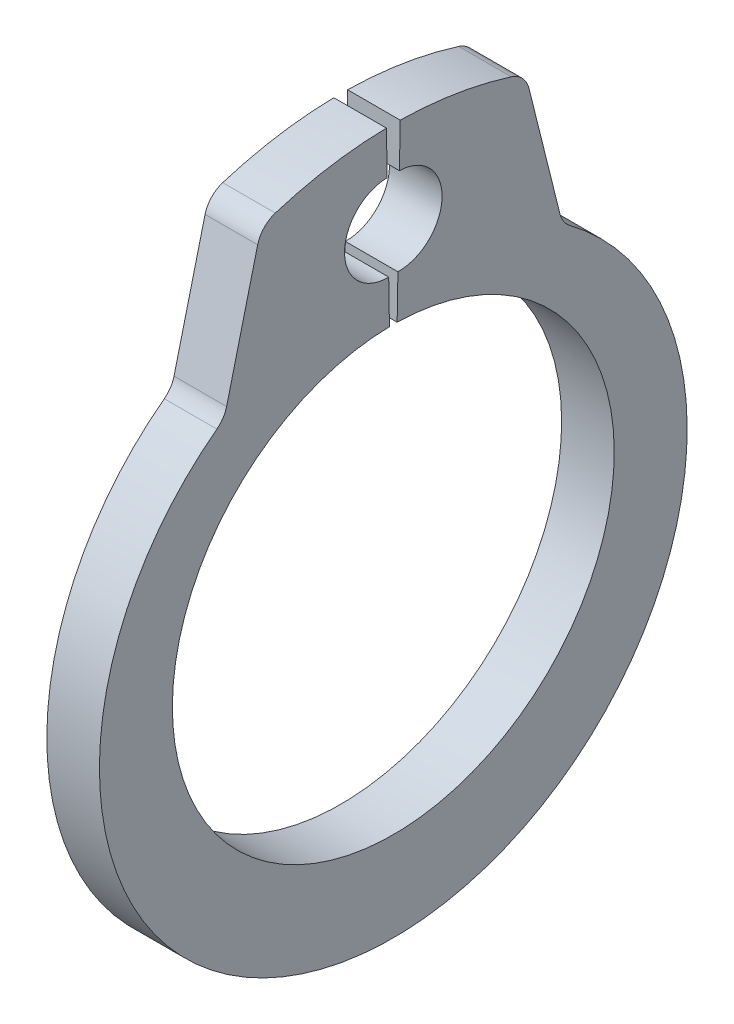
ISO-10303-21;
HEADER;
FILE_DESCRIPTION(('STEP AP214'),'2;1');
FILE_NAME('part.step','',(''),(''),'','','');
FILE_SCHEMA(('AUTOMOTIVE_DESIGN { 1 0 10303 214 1 1 1 1 }'));
ENDSEC;
DATA;
#1=APPLICATION_CONTEXT('core data for automotive mechanical design processes');
#2=APPLICATION_PROTOCOL_DEFINITION('international standard','automotive_design',2000,#1);
#3=PRODUCT_CONTEXT('',#1,'mechanical');
#4=PRODUCT('Part','Part','',(#3));
#5=PRODUCT_RELATED_PRODUCT_CATEGORY('part','',(#4));
#6=PRODUCT_DEFINITION_FORMATION('','',#4);
#7=PRODUCT_DEFINITION_CONTEXT('part definition',#1,'design');
#8=PRODUCT_DEFINITION('design','',#6,#7);
#9=PRODUCT_DEFINITION_SHAPE('','',#8);
#10=(LENGTH_UNIT() NAMED_UNIT(*) SI_UNIT(.MILLI.,.METRE.));
#11=(NAMED_UNIT(*) PLANE_ANGLE_UNIT() SI_UNIT($,.RADIAN.));
#12=(NAMED_UNIT(*) SI_UNIT($,.STERADIAN.) SOLID_ANGLE_UNIT());
#13=UNCERTAINTY_MEASURE_WITH_UNIT(LENGTH_MEASURE(1.E-05),#10,'distance_accuracy_value','');
#14=(GEOMETRIC_REPRESENTATION_CONTEXT(3) GLOBAL_UNCERTAINTY_ASSIGNED_CONTEXT((#13)) GLOBAL_UNIT_ASSIGNED_CONTEXT((#10,
#11,#12)) REPRESENTATION_CONTEXT('',''));
#15=CARTESIAN_POINT('',(0.,0.,0.));
#16=DIRECTION('',(0.,0.,1.));
#17=DIRECTION('',(1.,0.,0.));
#18=AXIS2_PLACEMENT_3D('',#15,#16,#17);
#19=CARTESIAN_POINT('',(0.5,0.,0.));
#20=DIRECTION('',(-1.,0.,0.));
#21=DIRECTION('',(0.,0.,1.));
#22=AXIS2_PLACEMENT_3D('',#19,#20,#21);
#23=CYLINDRICAL_SURFACE('',#22,4.2);
#24=CARTESIAN_POINT('',(-0.5,0.,0.));
#25=DIRECTION('',(-1.,0.,0.));
#26=DIRECTION('',(0.,0.,-1.));
#27=AXIS2_PLACEMENT_3D('',#24,#25,#26);
#28=CIRCLE('',#27,4.2);
#29=CARTESIAN_POINT('',(-0.5,4.19936031965684,-0.0733001070365909));
#30=VERTEX_POINT('',#29);
#31=CARTESIAN_POINT('',(-0.5,4.19936031965684,0.0733001070365909));
#32=VERTEX_POINT('',#31);
#33=EDGE_CURVE('E172',#30,#32,#28,.T.);
#34=ORIENTED_EDGE('',*,*,#33,.T.);
#35=DIRECTION('',(-1.,0.,0.));
#36=VECTOR('',#35,1.);
#37=CARTESIAN_POINT('',(0.5,4.19936031965684,0.0733001070365909));
#38=LINE('',#37,#36);
#39=CARTESIAN_POINT('',(0.5,4.19936031965684,0.0733001070365909));
#40=VERTEX_POINT('',#39);
#41=EDGE_CURVE('E153',#40,#32,#38,.T.);
#42=ORIENTED_EDGE('',*,*,#41,.F.);
#43=CARTESIAN_POINT('',(0.5,0.,0.));
#44=DIRECTION('',(-1.,0.,0.));
#45=DIRECTION('',(0.,0.,-1.));
#46=AXIS2_PLACEMENT_3D('',#43,#44,#45);
#47=CIRCLE('',#46,4.2);
#48=CARTESIAN_POINT('',(0.5,4.19936031965684,-0.0733001070365909));
#49=VERTEX_POINT('',#48);
#50=EDGE_CURVE('E159',#49,#40,#47,.T.);
#51=ORIENTED_EDGE('',*,*,#50,.F.);
#52=DIRECTION('',(-1.,0.,0.));
#53=VECTOR('',#52,1.);
#54=CARTESIAN_POINT('',(0.5,4.19936031965684,-0.0733001070365909));
#55=LINE('',#54,#53);
#56=EDGE_CURVE('E241',#49,#30,#55,.T.);
#57=ORIENTED_EDGE('',*,*,#56,.T.);
#58=EDGE_LOOP('',(#34,#42,#51,#57));
#59=FACE_BOUND('',#58,.T.);
#60=ADVANCED_FACE('F35',(#59),#23,.F.);
#61=CARTESIAN_POINT('',(0.5,5.02423466816087,0.0876983423473499));
#62=DIRECTION('',(0.,-0.0174524064372835,0.999847695156391));
#63=DIRECTION('',(0.,-0.999847695156391,-0.0174524064372835));
#64=AXIS2_PLACEMENT_3D('',#61,#62,#63);
#65=PLANE('',#64);
#66=DIRECTION('',(0.,0.999847695156391,0.0174524064372835));
#67=VECTOR('',#66,1.);
#68=CARTESIAN_POINT('',(-0.5,5.02423466816087,0.0876983423473499));
#69=LINE('',#68,#67);
#70=CARTESIAN_POINT('',(-0.5,5.02423466816087,0.0876983423473499));
#71=VERTEX_POINT('',#70);
#72=EDGE_CURVE('E243',#32,#71,#69,.T.);
#73=ORIENTED_EDGE('',*,*,#72,.T.);
#74=DIRECTION('',(-1.,0.,0.));
#75=VECTOR('',#74,1.);
#76=CARTESIAN_POINT('',(0.5,5.02423466816087,0.0876983423473499));
#77=LINE('',#76,#75);
#78=CARTESIAN_POINT('',(0.5,5.02423466816087,0.0876983423473499));
#79=VERTEX_POINT('',#78);
#80=EDGE_CURVE('E156',#79,#71,#77,.T.);
#81=ORIENTED_EDGE('',*,*,#80,.F.);
#82=DIRECTION('',(0.,0.999847695156391,0.0174524064372835));
#83=VECTOR('',#82,1.);
#84=CARTESIAN_POINT('',(0.5,5.02423466816087,0.0876983423473499));
#85=LINE('',#84,#83);
#86=EDGE_CURVE('E149',#40,#79,#85,.T.);
#87=ORIENTED_EDGE('',*,*,#86,.F.);
#88=ORIENTED_EDGE('',*,*,#41,.T.);
#89=EDGE_LOOP('',(#73,#81,#87,#88));
#90=FACE_BOUND('',#89,.T.);
#91=ADVANCED_FACE('F151',(#90),#65,.F.);
#92=CARTESIAN_POINT('',(0.5,5.84910901666489,0.102096577658109));
#93=DIRECTION('',(-1.,0.,0.));
#94=DIRECTION('',(0.,0.,1.));
#95=AXIS2_PLACEMENT_3D('',#92,#93,#94);
#96=CYLINDRICAL_SURFACE('',#95,0.825);
#97=CARTESIAN_POINT('',(-0.5,5.84910901666489,0.102096577658109));
#98=DIRECTION('',(-1.,0.,0.));
#99=DIRECTION('',(0.,0.,1.));
#100=AXIS2_PLACEMENT_3D('',#97,#98,#99);
#101=CIRCLE('',#100,0.825);
#102=CARTESIAN_POINT('',(-0.5,6.67398336516891,0.116494812968868));
#103=VERTEX_POINT('',#102);
#104=EDGE_CURVE('E245',#71,#103,#101,.T.);
#105=ORIENTED_EDGE('',*,*,#104,.T.);
#106=DIRECTION('',(-1.,0.,0.));
#107=VECTOR('',#106,1.);
#108=CARTESIAN_POINT('',(0.5,6.67398336516891,0.116494812968868));
#109=LINE('',#108,#107);
#110=CARTESIAN_POINT('',(0.5,6.67398336516891,0.116494812968868));
#111=VERTEX_POINT('',#110);
#112=EDGE_CURVE('E177',#111,#103,#109,.T.);
#113=ORIENTED_EDGE('',*,*,#112,.F.);
#114=CARTESIAN_POINT('',(0.5,5.84910901666489,0.102096577658109));
#115=DIRECTION('',(-1.,0.,0.));
#116=DIRECTION('',(0.,0.,1.));
#117=AXIS2_PLACEMENT_3D('',#114,#115,#116);
#118=CIRCLE('',#117,0.825);
#119=EDGE_CURVE('E158',#79,#111,#118,.T.);
#120=ORIENTED_EDGE('',*,*,#119,.F.);
#121=ORIENTED_EDGE('',*,*,#80,.T.);
#122=EDGE_LOOP('',(#105,#113,#120,#121));
#123=FACE_BOUND('',#122,.T.);
#124=ADVANCED_FACE('F303',(#123),#96,.F.);
#125=CARTESIAN_POINT('',(0.5,6.67398336516891,0.116494812968868));
#126=DIRECTION('',(0.,-0.0174524064372835,0.999847695156391));
#127=DIRECTION('',(0.,-0.999847695156391,-0.0174524064372835));
#128=AXIS2_PLACEMENT_3D('',#125,#126,#127);
#129=PLANE('',#128);
#130=DIRECTION('',(0.,0.999847695156391,0.0174524064372835));
#131=VECTOR('',#130,1.);
#132=CARTESIAN_POINT('',(-0.5,6.67398336516891,0.116494812968868));
#133=LINE('',#132,#131);
#134=CARTESIAN_POINT('',(-0.5,7.49885771367294,0.130893048279627));
#135=VERTEX_POINT('',#134);
#136=EDGE_CURVE('E247',#103,#135,#133,.T.);
#137=ORIENTED_EDGE('',*,*,#136,.T.);
#138=DIRECTION('',(-1.,0.,0.));
#139=VECTOR('',#138,1.);
#140=CARTESIAN_POINT('',(0.5,7.49885771367294,0.130893048279627));
#141=LINE('',#140,#139);
#142=CARTESIAN_POINT('',(0.5,7.49885771367294,0.130893048279627));
#143=VERTEX_POINT('',#142);
#144=EDGE_CURVE('E272',#143,#135,#141,.T.);
#145=ORIENTED_EDGE('',*,*,#144,.F.);
#146=DIRECTION('',(0.,0.999847695156391,0.0174524064372835));
#147=VECTOR('',#146,1.);
#148=CARTESIAN_POINT('',(0.5,6.67398336516891,0.116494812968868));
#149=LINE('',#148,#147);
#150=EDGE_CURVE('E281',#111,#143,#149,.T.);
#151=ORIENTED_EDGE('',*,*,#150,.F.);
#152=ORIENTED_EDGE('',*,*,#112,.T.);
#153=EDGE_LOOP('',(#137,#145,#151,#152));
#154=FACE_BOUND('',#153,.T.);
#155=ADVANCED_FACE('F279',(#154),#129,.F.);
#156=CARTESIAN_POINT('',(0.5,0.,0.));
#157=DIRECTION('',(-1.,0.,0.));
#158=DIRECTION('',(0.,0.,1.));
#159=AXIS2_PLACEMENT_3D('',#156,#157,#158);
#160=CYLINDRICAL_SURFACE('',#159,7.5);
#161=CARTESIAN_POINT('',(-0.5,0.,0.));
#162=DIRECTION('',(1.,0.,0.));
#163=DIRECTION('',(0.,0.,-1.));
#164=AXIS2_PLACEMENT_3D('',#161,#162,#163);
#165=CIRCLE('',#164,7.5);
#166=CARTESIAN_POINT('',(-0.5,7.15673316642815,2.24302705836272));
#167=VERTEX_POINT('',#166);
#168=EDGE_CURVE('E249',#135,#167,#165,.T.);
#169=ORIENTED_EDGE('',*,*,#168,.T.);
#170=DIRECTION('',(-1.,0.,0.));
#171=VECTOR('',#170,1.);
#172=CARTESIAN_POINT('',(0.5,7.15673316642815,2.24302705836272));
#173=LINE('',#172,#171);
#174=CARTESIAN_POINT('',(0.5,7.15673316642815,2.24302705836272));
#175=VERTEX_POINT('',#174);
#176=EDGE_CURVE('E192',#167,#175,#173,.F.);
#177=ORIENTED_EDGE('',*,*,#176,.T.);
#178=CARTESIAN_POINT('',(0.5,0.,0.));
#179=DIRECTION('',(1.,0.,0.));
#180=DIRECTION('',(0.,0.,-1.));
#181=AXIS2_PLACEMENT_3D('',#178,#179,#180);
#182=CIRCLE('',#181,7.5);
#183=EDGE_CURVE('E296',#143,#175,#182,.T.);
#184=ORIENTED_EDGE('',*,*,#183,.F.);
#185=ORIENTED_EDGE('',*,*,#144,.T.);
#186=EDGE_LOOP('',(#169,#177,#184,#185));
#187=FACE_BOUND('',#186,.T.);
#188=ADVANCED_FACE('F287',(#187),#160,.T.);
#189=CARTESIAN_POINT('',(0.5,7.06671232941493,2.51228518550246));
#190=DIRECTION('',(0.,-0.241921895599664,-0.970295726275997));
#191=DIRECTION('',(0.,0.970295726275997,-0.241921895599664));
#192=AXIS2_PLACEMENT_3D('',#189,#190,#191);
#193=PLANE('',#192);
#194=DIRECTION('',(0.,-0.970295726275997,0.241921895599664));
#195=VECTOR('',#194,1.);
#196=CARTESIAN_POINT('',(-0.5,7.06671232941493,2.51228518550246));
#197=LINE('',#196,#195);
#198=CARTESIAN_POINT('',(-0.5,6.80057856979944,2.57863978427653));
#199=VERTEX_POINT('',#198);
#200=CARTESIAN_POINT('',(-0.5,4.43351148719192,3.16881589257889));
#201=VERTEX_POINT('',#200);
#202=EDGE_CURVE('E223',#199,#201,#197,.T.);
#203=ORIENTED_EDGE('',*,*,#202,.T.);
#204=DIRECTION('',(1.,0.,0.));
#205=VECTOR('',#204,1.);
#206=CARTESIAN_POINT('',(0.5,4.43351148719192,3.16881589257889));
#207=LINE('',#206,#205);
#208=CARTESIAN_POINT('',(0.5,4.43351148719192,3.16881589257889));
#209=VERTEX_POINT('',#208);
#210=EDGE_CURVE('E186',#201,#209,#207,.T.);
#211=ORIENTED_EDGE('',*,*,#210,.T.);
#212=DIRECTION('',(0.,-0.970295726275997,0.241921895599664));
#213=VECTOR('',#212,1.);
#214=CARTESIAN_POINT('',(0.5,7.06671232941493,2.51228518550246));
#215=LINE('',#214,#213);
#216=CARTESIAN_POINT('',(0.5,6.80057856979944,2.57863978427653));
#217=VERTEX_POINT('',#216);
#218=EDGE_CURVE('E233',#217,#209,#215,.T.);
#219=ORIENTED_EDGE('',*,*,#218,.F.);
#220=DIRECTION('',(-1.,0.,0.));
#221=VECTOR('',#220,1.);
#222=CARTESIAN_POINT('',(0.5,6.80057856979944,2.57863978427653));
#223=LINE('',#222,#221);
#224=EDGE_CURVE('E183',#217,#199,#223,.T.);
#225=ORIENTED_EDGE('',*,*,#224,.T.);
#226=EDGE_LOOP('',(#203,#211,#219,#225));
#227=FACE_BOUND('',#226,.T.);
#228=ADVANCED_FACE('F298',(#227),#193,.F.);
#229=CARTESIAN_POINT('',(0.5,-0.313357386745426,0.));
#230=DIRECTION('',(-1.,0.,0.));
#231=DIRECTION('',(0.,0.,1.));
#232=AXIS2_PLACEMENT_3D('',#229,#230,#231);
#233=CYLINDRICAL_SURFACE('',#232,5.58664261325457);
#234=CARTESIAN_POINT('',(0.5,-0.313357386745426,0.));
#235=DIRECTION('',(1.,0.,0.));
#236=DIRECTION('',(0.,0.,-1.));
#237=AXIS2_PLACEMENT_3D('',#234,#235,#236);
#238=CIRCLE('',#237,5.58664261325457);
#239=CARTESIAN_POINT('',(0.5,4.15459436336514,3.35380125334162));
#240=VERTEX_POINT('',#239);
#241=CARTESIAN_POINT('',(0.5,4.15459436336513,-3.35380125334163));
#242=VERTEX_POINT('',#241);
#243=EDGE_CURVE('E227',#240,#242,#238,.T.);
#244=ORIENTED_EDGE('',*,*,#243,.F.);
#245=DIRECTION('',(-1.,0.,0.));
#246=VECTOR('',#245,1.);
#247=CARTESIAN_POINT('',(0.5,4.15459436336514,3.35380125334162));
#248=LINE('',#247,#246);
#249=CARTESIAN_POINT('',(-0.5,4.15459436336514,3.35380125334162));
#250=VERTEX_POINT('',#249);
#251=EDGE_CURVE('E175',#240,#250,#248,.T.);
#252=ORIENTED_EDGE('',*,*,#251,.T.);
#253=CARTESIAN_POINT('',(-0.5,-0.313357386745426,0.));
#254=DIRECTION('',(1.,0.,0.));
#255=DIRECTION('',(0.,0.,-1.));
#256=AXIS2_PLACEMENT_3D('',#253,#254,#255);
#257=CIRCLE('',#256,5.58664261325457);
#258=CARTESIAN_POINT('',(-0.5,4.15459436336513,-3.35380125334163));
#259=VERTEX_POINT('',#258);
#260=EDGE_CURVE('E213',#250,#259,#257,.T.);
#261=ORIENTED_EDGE('',*,*,#260,.T.);
#262=DIRECTION('',(-1.,0.,0.));
#263=VECTOR('',#262,1.);
#264=CARTESIAN_POINT('',(0.5,4.15459436336514,-3.35380125334163));
#265=LINE('',#264,#263);
#266=EDGE_CURVE('E173',#259,#242,#265,.F.);
#267=ORIENTED_EDGE('',*,*,#266,.T.);
#268=EDGE_LOOP('',(#244,#252,#261,#267));
#269=FACE_BOUND('',#268,.T.);
#270=ADVANCED_FACE('F220',(#269),#233,.T.);
#271=CARTESIAN_POINT('',(0.5,7.06671232941492,-2.51228518550246));
#272=DIRECTION('',(0.,-0.241921895599666,0.970295726275997));
#273=DIRECTION('',(0.,-0.970295726275997,-0.241921895599666));
#274=AXIS2_PLACEMENT_3D('',#271,#272,#273);
#275=PLANE('',#274);
#276=DIRECTION('',(0.,0.970295726275997,0.241921895599666));
#277=VECTOR('',#276,1.);
#278=CARTESIAN_POINT('',(-0.5,7.06671232941492,-2.51228518550246));
#279=LINE('',#278,#277);
#280=CARTESIAN_POINT('',(-0.5,4.43351148719191,-3.1688158925789));
#281=VERTEX_POINT('',#280);
#282=CARTESIAN_POINT('',(-0.5,6.80057856979944,-2.57863978427653));
#283=VERTEX_POINT('',#282);
#284=EDGE_CURVE('E214',#281,#283,#279,.T.);
#285=ORIENTED_EDGE('',*,*,#284,.T.);
#286=DIRECTION('',(-1.,0.,0.));
#287=VECTOR('',#286,1.);
#288=CARTESIAN_POINT('',(0.5,6.80057856979944,-2.57863978427653));
#289=LINE('',#288,#287);
#290=CARTESIAN_POINT('',(0.5,6.80057856979944,-2.57863978427653));
#291=VERTEX_POINT('',#290);
#292=EDGE_CURVE('E58',#283,#291,#289,.F.);
#293=ORIENTED_EDGE('',*,*,#292,.T.);
#294=DIRECTION('',(0.,0.970295726275997,0.241921895599666));
#295=VECTOR('',#294,1.);
#296=CARTESIAN_POINT('',(0.5,7.06671232941492,-2.51228518550246));
#297=LINE('',#296,#295);
#298=CARTESIAN_POINT('',(0.5,4.43351148719191,-3.1688158925789));
#299=VERTEX_POINT('',#298);
#300=EDGE_CURVE('E226',#299,#291,#297,.T.);
#301=ORIENTED_EDGE('',*,*,#300,.F.);
#302=DIRECTION('',(1.,0.,0.));
#303=VECTOR('',#302,1.);
#304=CARTESIAN_POINT('',(-0.5,4.43351148719191,-3.1688158925789));
#305=LINE('',#304,#303);
#306=EDGE_CURVE('E200',#299,#281,#305,.F.);
#307=ORIENTED_EDGE('',*,*,#306,.T.);
#308=EDGE_LOOP('',(#285,#293,#301,#307));
#309=FACE_BOUND('',#308,.T.);
#310=ADVANCED_FACE('F228',(#309),#275,.F.);
#311=CARTESIAN_POINT('',(0.5,0.,0.));
#312=DIRECTION('',(-1.,0.,0.));
#313=DIRECTION('',(0.,0.,1.));
#314=AXIS2_PLACEMENT_3D('',#311,#312,#313);
#315=CYLINDRICAL_SURFACE('',#314,7.5);
#316=CARTESIAN_POINT('',(0.5,0.,0.));
#317=DIRECTION('',(1.,0.,0.));
#318=DIRECTION('',(0.,0.,1.));
#319=AXIS2_PLACEMENT_3D('',#316,#317,#318);
#320=CIRCLE('',#319,7.5);
#321=CARTESIAN_POINT('',(0.5,7.15673316642815,-2.24302705836272));
#322=VERTEX_POINT('',#321);
#323=CARTESIAN_POINT('',(0.5,7.49885771367293,-0.130893048279629));
#324=VERTEX_POINT('',#323);
#325=EDGE_CURVE('E229',#322,#324,#320,.T.);
#326=ORIENTED_EDGE('',*,*,#325,.F.);
#327=DIRECTION('',(-1.,0.,0.));
#328=VECTOR('',#327,1.);
#329=CARTESIAN_POINT('',(0.5,7.15673316642815,-2.24302705836272));
#330=LINE('',#329,#328);
#331=CARTESIAN_POINT('',(-0.5,7.15673316642815,-2.24302705836272));
#332=VERTEX_POINT('',#331);
#333=EDGE_CURVE('E197',#322,#332,#330,.T.);
#334=ORIENTED_EDGE('',*,*,#333,.T.);
#335=CARTESIAN_POINT('',(-0.5,0.,0.));
#336=DIRECTION('',(1.,0.,0.));
#337=DIRECTION('',(0.,0.,1.));
#338=AXIS2_PLACEMENT_3D('',#335,#336,#337);
#339=CIRCLE('',#338,7.5);
#340=CARTESIAN_POINT('',(-0.5,7.49885771367293,-0.130893048279629));
#341=VERTEX_POINT('',#340);
#342=EDGE_CURVE('E255',#332,#341,#339,.T.);
#343=ORIENTED_EDGE('',*,*,#342,.T.);
#344=DIRECTION('',(-1.,0.,0.));
#345=VECTOR('',#344,1.);
#346=CARTESIAN_POINT('',(0.5,7.49885771367293,-0.130893048279629));
#347=LINE('',#346,#345);
#348=EDGE_CURVE('E269',#324,#341,#347,.T.);
#349=ORIENTED_EDGE('',*,*,#348,.F.);
#350=EDGE_LOOP('',(#326,#334,#343,#349));
#351=FACE_BOUND('',#350,.T.);
#352=ADVANCED_FACE('F331',(#351),#315,.T.);
#353=CARTESIAN_POINT('',(0.5,6.67398336516891,-0.116494812968869));
#354=DIRECTION('',(0.,-0.0174524064372838,-0.999847695156391));
#355=DIRECTION('',(0.,0.999847695156391,-0.0174524064372838));
#356=AXIS2_PLACEMENT_3D('',#353,#354,#355);
#357=PLANE('',#356);
#358=DIRECTION('',(0.,-0.999847695156391,0.0174524064372838));
#359=VECTOR('',#358,1.);
#360=CARTESIAN_POINT('',(-0.5,6.67398336516891,-0.116494812968869));
#361=LINE('',#360,#359);
#362=CARTESIAN_POINT('',(-0.5,6.67398336516891,-0.116494812968869));
#363=VERTEX_POINT('',#362);
#364=EDGE_CURVE('E257',#341,#363,#361,.T.);
#365=ORIENTED_EDGE('',*,*,#364,.T.);
#366=DIRECTION('',(-1.,0.,0.));
#367=VECTOR('',#366,1.);
#368=CARTESIAN_POINT('',(0.5,6.67398336516891,-0.116494812968869));
#369=LINE('',#368,#367);
#370=CARTESIAN_POINT('',(0.5,6.67398336516891,-0.116494812968869));
#371=VERTEX_POINT('',#370);
#372=EDGE_CURVE('E266',#371,#363,#369,.T.);
#373=ORIENTED_EDGE('',*,*,#372,.F.);
#374=DIRECTION('',(0.,-0.999847695156391,0.0174524064372838));
#375=VECTOR('',#374,1.);
#376=CARTESIAN_POINT('',(0.5,6.67398336516891,-0.116494812968869));
#377=LINE('',#376,#375);
#378=EDGE_CURVE('E231',#324,#371,#377,.T.);
#379=ORIENTED_EDGE('',*,*,#378,.F.);
#380=ORIENTED_EDGE('',*,*,#348,.T.);
#381=EDGE_LOOP('',(#365,#373,#379,#380));
#382=FACE_BOUND('',#381,.T.);
#383=ADVANCED_FACE('F338',(#382),#357,.F.);
#384=CARTESIAN_POINT('',(0.5,5.84910901666489,-0.10209657765811));
#385=DIRECTION('',(-1.,0.,0.));
#386=DIRECTION('',(0.,0.,1.));
#387=AXIS2_PLACEMENT_3D('',#384,#385,#386);
#388=CYLINDRICAL_SURFACE('',#387,0.825);
#389=CARTESIAN_POINT('',(-0.5,5.84910901666489,-0.10209657765811));
#390=DIRECTION('',(-1.,0.,0.));
#391=DIRECTION('',(0.,0.,1.));
#392=AXIS2_PLACEMENT_3D('',#389,#390,#391);
#393=CIRCLE('',#392,0.825);
#394=CARTESIAN_POINT('',(-0.5,5.02423466816087,-0.0876983423473517));
#395=VERTEX_POINT('',#394);
#396=EDGE_CURVE('E259',#363,#395,#393,.T.);
#397=ORIENTED_EDGE('',*,*,#396,.T.);
#398=DIRECTION('',(-1.,0.,0.));
#399=VECTOR('',#398,1.);
#400=CARTESIAN_POINT('',(0.5,5.02423466816087,-0.0876983423473517));
#401=LINE('',#400,#399);
#402=CARTESIAN_POINT('',(0.5,5.02423466816087,-0.0876983423473517));
#403=VERTEX_POINT('',#402);
#404=EDGE_CURVE('E263',#403,#395,#401,.T.);
#405=ORIENTED_EDGE('',*,*,#404,.F.);
#406=CARTESIAN_POINT('',(0.5,5.84910901666489,-0.10209657765811));
#407=DIRECTION('',(-1.,0.,0.));
#408=DIRECTION('',(0.,0.,1.));
#409=AXIS2_PLACEMENT_3D('',#406,#407,#408);
#410=CIRCLE('',#409,0.825);
#411=EDGE_CURVE('E238',#371,#403,#410,.T.);
#412=ORIENTED_EDGE('',*,*,#411,.F.);
#413=ORIENTED_EDGE('',*,*,#372,.T.);
#414=EDGE_LOOP('',(#397,#405,#412,#413));
#415=FACE_BOUND('',#414,.T.);
#416=ADVANCED_FACE('F342',(#415),#388,.F.);
#417=CARTESIAN_POINT('',(0.5,4.19936031965684,-0.0733001070365909));
#418=DIRECTION('',(0.,-0.0174524064372852,-0.999847695156391));
#419=DIRECTION('',(0.,0.999847695156391,-0.0174524064372852));
#420=AXIS2_PLACEMENT_3D('',#417,#418,#419);
#421=PLANE('',#420);
#422=DIRECTION('',(0.,-0.999847695156391,0.0174524064372852));
#423=VECTOR('',#422,1.);
#424=CARTESIAN_POINT('',(-0.5,4.19936031965684,-0.0733001070365909));
#425=LINE('',#424,#423);
#426=EDGE_CURVE('E169',#395,#30,#425,.T.);
#427=ORIENTED_EDGE('',*,*,#426,.T.);
#428=ORIENTED_EDGE('',*,*,#56,.F.);
#429=DIRECTION('',(0.,-0.999847695156391,0.0174524064372852));
#430=VECTOR('',#429,1.);
#431=CARTESIAN_POINT('',(0.5,4.19936031965684,-0.0733001070365909));
#432=LINE('',#431,#430);
#433=EDGE_CURVE('E165',#403,#49,#432,.T.);
#434=ORIENTED_EDGE('',*,*,#433,.F.);
#435=ORIENTED_EDGE('',*,*,#404,.T.);
#436=EDGE_LOOP('',(#427,#428,#434,#435));
#437=FACE_BOUND('',#436,.T.);
#438=ADVANCED_FACE('F345',(#437),#421,.F.);
#439=CARTESIAN_POINT('',(0.5,0.,0.));
#440=DIRECTION('',(1.,0.,0.));
#441=DIRECTION('',(0.,0.,-1.));
#442=AXIS2_PLACEMENT_3D('',#439,#440,#441);
#443=PLANE('',#442);
#444=ORIENTED_EDGE('',*,*,#183,.T.);
#445=CARTESIAN_POINT('',(0.5,6.67961762199961,2.09349192113854));
#446=DIRECTION('',(1.,0.,0.));
#447=DIRECTION('',(0.,0.,-1.));
#448=AXIS2_PLACEMENT_3D('',#445,#446,#447);
#449=CIRCLE('',#448,0.5);
#450=EDGE_CURVE('E195',#175,#217,#449,.T.);
#451=ORIENTED_EDGE('',*,*,#450,.T.);
#452=ORIENTED_EDGE('',*,*,#218,.T.);
#453=CARTESIAN_POINT('',(0.5,4.55447243499175,3.65396375571689));
#454=DIRECTION('',(1.,0.,0.));
#455=DIRECTION('',(0.,0.,-1.));
#456=AXIS2_PLACEMENT_3D('',#453,#454,#455);
#457=CIRCLE('',#456,0.5);
#458=EDGE_CURVE('E206',#209,#240,#457,.F.);
#459=ORIENTED_EDGE('',*,*,#458,.T.);
#460=ORIENTED_EDGE('',*,*,#243,.T.);
#461=CARTESIAN_POINT('',(0.5,4.55447243499174,-3.6539637557169));
#462=DIRECTION('',(1.,0.,0.));
#463=DIRECTION('',(0.,0.,-1.));
#464=AXIS2_PLACEMENT_3D('',#461,#462,#463);
#465=CIRCLE('',#464,0.5);
#466=EDGE_CURVE('E11',#242,#299,#465,.F.);
#467=ORIENTED_EDGE('',*,*,#466,.T.);
#468=ORIENTED_EDGE('',*,*,#300,.T.);
#469=CARTESIAN_POINT('',(0.5,6.6796176219996,-2.09349192113854));
#470=DIRECTION('',(1.,0.,0.));
#471=DIRECTION('',(0.,0.,-1.));
#472=AXIS2_PLACEMENT_3D('',#469,#470,#471);
#473=CIRCLE('',#472,0.5);
#474=EDGE_CURVE('E50',#291,#322,#473,.T.);
#475=ORIENTED_EDGE('',*,*,#474,.T.);
#476=ORIENTED_EDGE('',*,*,#325,.T.);
#477=ORIENTED_EDGE('',*,*,#378,.T.);
#478=ORIENTED_EDGE('',*,*,#411,.T.);
#479=ORIENTED_EDGE('',*,*,#433,.T.);
#480=ORIENTED_EDGE('',*,*,#50,.T.);
#481=ORIENTED_EDGE('',*,*,#86,.T.);
#482=ORIENTED_EDGE('',*,*,#119,.T.);
#483=ORIENTED_EDGE('',*,*,#150,.T.);
#484=EDGE_LOOP('',(#444,#451,#452,#459,#460,#467,#468,#475,#476,#477,#478,#479,#480,#481,#482,#483));
#485=FACE_BOUND('',#484,.T.);
#486=ADVANCED_FACE('F163',(#485),#443,.T.);
#487=CARTESIAN_POINT('',(-0.5,0.,0.));
#488=DIRECTION('',(1.,0.,0.));
#489=DIRECTION('',(0.,0.,-1.));
#490=AXIS2_PLACEMENT_3D('',#487,#488,#489);
#491=PLANE('',#490);
#492=ORIENTED_EDGE('',*,*,#202,.F.);
#493=CARTESIAN_POINT('',(-0.5,6.67961762199961,2.09349192113854));
#494=DIRECTION('',(1.,0.,0.));
#495=DIRECTION('',(0.,0.,-1.));
#496=AXIS2_PLACEMENT_3D('',#493,#494,#495);
#497=CIRCLE('',#496,0.5);
#498=EDGE_CURVE('E190',#199,#167,#497,.F.);
#499=ORIENTED_EDGE('',*,*,#498,.T.);
#500=ORIENTED_EDGE('',*,*,#168,.F.);
#501=ORIENTED_EDGE('',*,*,#136,.F.);
#502=ORIENTED_EDGE('',*,*,#104,.F.);
#503=ORIENTED_EDGE('',*,*,#72,.F.);
#504=ORIENTED_EDGE('',*,*,#33,.F.);
#505=ORIENTED_EDGE('',*,*,#426,.F.);
#506=ORIENTED_EDGE('',*,*,#396,.F.);
#507=ORIENTED_EDGE('',*,*,#364,.F.);
#508=ORIENTED_EDGE('',*,*,#342,.F.);
#509=CARTESIAN_POINT('',(-0.5,6.6796176219996,-2.09349192113854));
#510=DIRECTION('',(1.,0.,0.));
#511=DIRECTION('',(0.,0.,-1.));
#512=AXIS2_PLACEMENT_3D('',#509,#510,#511);
#513=CIRCLE('',#512,0.5);
#514=EDGE_CURVE('E188',#332,#283,#513,.F.);
#515=ORIENTED_EDGE('',*,*,#514,.T.);
#516=ORIENTED_EDGE('',*,*,#284,.F.);
#517=CARTESIAN_POINT('',(-0.5,4.55447243499174,-3.6539637557169));
#518=DIRECTION('',(1.,0.,0.));
#519=DIRECTION('',(0.,0.,-1.));
#520=AXIS2_PLACEMENT_3D('',#517,#518,#519);
#521=CIRCLE('',#520,0.5);
#522=EDGE_CURVE('E43',#281,#259,#521,.T.);
#523=ORIENTED_EDGE('',*,*,#522,.T.);
#524=ORIENTED_EDGE('',*,*,#260,.F.);
#525=CARTESIAN_POINT('',(-0.5,4.55447243499175,3.65396375571689));
#526=DIRECTION('',(1.,0.,0.));
#527=DIRECTION('',(0.,0.,-1.));
#528=AXIS2_PLACEMENT_3D('',#525,#526,#527);
#529=CIRCLE('',#528,0.5);
#530=EDGE_CURVE('E204',#250,#201,#529,.T.);
#531=ORIENTED_EDGE('',*,*,#530,.T.);
#532=EDGE_LOOP('',(#492,#499,#500,#501,#502,#503,#504,#505,#506,#507,#508,#515,#516,#523,#524,#531));
#533=FACE_BOUND('',#532,.T.);
#534=ADVANCED_FACE('F212',(#533),#491,.F.);
#535=CARTESIAN_POINT('',(0.5,4.55447243499175,3.65396375571689));
#536=DIRECTION('',(-1.,0.,0.));
#537=DIRECTION('',(0.,0.,1.));
#538=AXIS2_PLACEMENT_3D('',#535,#536,#537);
#539=CYLINDRICAL_SURFACE('',#538,0.5);
#540=ORIENTED_EDGE('',*,*,#458,.F.);
#541=ORIENTED_EDGE('',*,*,#210,.F.);
#542=ORIENTED_EDGE('',*,*,#530,.F.);
#543=ORIENTED_EDGE('',*,*,#251,.F.);
#544=EDGE_LOOP('',(#540,#541,#542,#543));
#545=FACE_BOUND('',#544,.T.);
#546=ADVANCED_FACE('F317',(#545),#539,.F.);
#547=CARTESIAN_POINT('',(0.5,6.67961762199961,2.09349192113854));
#548=DIRECTION('',(-1.,0.,0.));
#549=DIRECTION('',(0.,0.,1.));
#550=AXIS2_PLACEMENT_3D('',#547,#548,#549);
#551=CYLINDRICAL_SURFACE('',#550,0.5);
#552=ORIENTED_EDGE('',*,*,#450,.F.);
#553=ORIENTED_EDGE('',*,*,#176,.F.);
#554=ORIENTED_EDGE('',*,*,#498,.F.);
#555=ORIENTED_EDGE('',*,*,#224,.F.);
#556=EDGE_LOOP('',(#552,#553,#554,#555));
#557=FACE_BOUND('',#556,.T.);
#558=ADVANCED_FACE('F291',(#557),#551,.T.);
#559=CARTESIAN_POINT('',(0.5,6.6796176219996,-2.09349192113854));
#560=DIRECTION('',(-1.,0.,0.));
#561=DIRECTION('',(0.,0.,1.));
#562=AXIS2_PLACEMENT_3D('',#559,#560,#561);
#563=CYLINDRICAL_SURFACE('',#562,0.5);
#564=ORIENTED_EDGE('',*,*,#474,.F.);
#565=ORIENTED_EDGE('',*,*,#292,.F.);
#566=ORIENTED_EDGE('',*,*,#514,.F.);
#567=ORIENTED_EDGE('',*,*,#333,.F.);
#568=EDGE_LOOP('',(#564,#565,#566,#567));
#569=FACE_BOUND('',#568,.T.);
#570=ADVANCED_FACE('F322',(#569),#563,.T.);
#571=CARTESIAN_POINT('',(0.5,4.55447243499174,-3.6539637557169));
#572=DIRECTION('',(-1.,0.,0.));
#573=DIRECTION('',(0.,0.,1.));
#574=AXIS2_PLACEMENT_3D('',#571,#572,#573);
#575=CYLINDRICAL_SURFACE('',#574,0.5);
#576=ORIENTED_EDGE('',*,*,#466,.F.);
#577=ORIENTED_EDGE('',*,*,#266,.F.);
#578=ORIENTED_EDGE('',*,*,#522,.F.);
#579=ORIENTED_EDGE('',*,*,#306,.F.);
#580=EDGE_LOOP('',(#576,#577,#578,#579));
#581=FACE_BOUND('',#580,.T.);
#582=ADVANCED_FACE('F37',(#581),#575,.F.);
#583=CLOSED_SHELL('',(#60,#91,#124,#155,#188,#228,#270,#310,#352,#383,#416,#438,#486,#534,#546,
#558,#570,#582));
#584=MANIFOLD_SOLID_BREP('B2',#583);
#585=ADVANCED_BREP_SHAPE_REPRESENTATION('',(#18,#584),#14);
#586=SHAPE_DEFINITION_REPRESENTATION(#9,#585);
ENDSEC;
END-ISO-10303-21;
